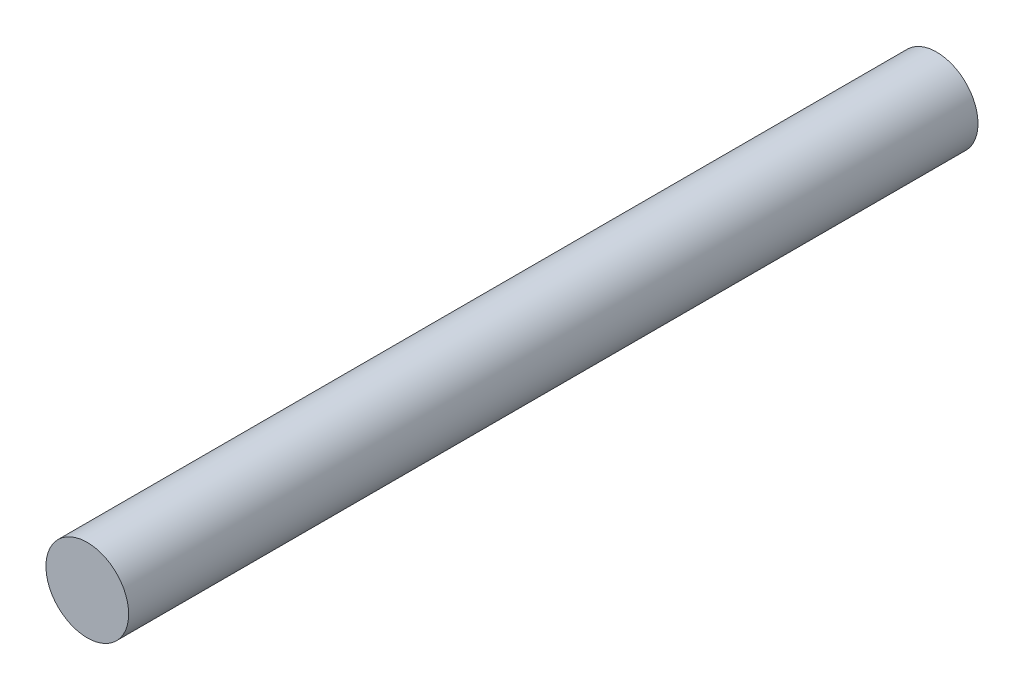
ISO-10303-21;
HEADER;
FILE_DESCRIPTION(('STEP AP214'),'2;1');
FILE_NAME('part.step','',(''),(''),'','','');
FILE_SCHEMA(('AUTOMOTIVE_DESIGN { 1 0 10303 214 1 1 1 1 }'));
ENDSEC;
DATA;
#1=APPLICATION_CONTEXT('core data for automotive mechanical design processes');
#2=APPLICATION_PROTOCOL_DEFINITION('international standard','automotive_design',2000,#1);
#3=PRODUCT_CONTEXT('',#1,'mechanical');
#4=PRODUCT('Part','Part','',(#3));
#5=PRODUCT_RELATED_PRODUCT_CATEGORY('part','',(#4));
#6=PRODUCT_DEFINITION_FORMATION('','',#4);
#7=PRODUCT_DEFINITION_CONTEXT('part definition',#1,'design');
#8=PRODUCT_DEFINITION('design','',#6,#7);
#9=PRODUCT_DEFINITION_SHAPE('','',#8);
#10=(LENGTH_UNIT() NAMED_UNIT(*) SI_UNIT(.MILLI.,.METRE.));
#11=(NAMED_UNIT(*) PLANE_ANGLE_UNIT() SI_UNIT($,.RADIAN.));
#12=(NAMED_UNIT(*) SI_UNIT($,.STERADIAN.) SOLID_ANGLE_UNIT());
#13=UNCERTAINTY_MEASURE_WITH_UNIT(LENGTH_MEASURE(1.E-05),#10,'distance_accuracy_value','');
#14=(GEOMETRIC_REPRESENTATION_CONTEXT(3) GLOBAL_UNCERTAINTY_ASSIGNED_CONTEXT((#13)) GLOBAL_UNIT_ASSIGNED_CONTEXT((#10,
#11,#12)) REPRESENTATION_CONTEXT('',''));
#15=CARTESIAN_POINT('',(0.,0.,0.));
#16=DIRECTION('',(0.,0.,1.));
#17=DIRECTION('',(1.,0.,0.));
#18=AXIS2_PLACEMENT_3D('',#15,#16,#17);
#19=CARTESIAN_POINT('',(0.,0.,115.));
#20=DIRECTION('',(0.,0.,-1.));
#21=DIRECTION('',(-1.,0.,0.));
#22=AXIS2_PLACEMENT_3D('',#19,#20,#21);
#23=CYLINDRICAL_SURFACE('',#22,5.6);
#24=CARTESIAN_POINT('',(0.,0.,0.));
#25=DIRECTION('',(0.,0.,1.));
#26=DIRECTION('',(1.,0.,0.));
#27=AXIS2_PLACEMENT_3D('',#24,#25,#26);
#28=CIRCLE('',#27,5.6);
#29=CARTESIAN_POINT('',(5.6,0.,0.));
#30=VERTEX_POINT('',#29);
#31=EDGE_CURVE('E104',#30,#30,#28,.T.);
#32=ORIENTED_EDGE('',*,*,#31,.T.);
#33=EDGE_LOOP('',(#32));
#34=FACE_BOUND('',#33,.T.);
#35=CARTESIAN_POINT('',(0.,0.,115.));
#36=DIRECTION('',(0.,0.,1.));
#37=DIRECTION('',(1.,0.,0.));
#38=AXIS2_PLACEMENT_3D('',#35,#36,#37);
#39=CIRCLE('',#38,5.6);
#40=CARTESIAN_POINT('',(5.6,0.,115.));
#41=VERTEX_POINT('',#40);
#42=EDGE_CURVE('E107',#41,#41,#39,.T.);
#43=ORIENTED_EDGE('',*,*,#42,.F.);
#44=EDGE_LOOP('',(#43));
#45=FACE_BOUND('',#44,.T.);
#46=CARTESIAN_POINT('',(0.,0.,30.));
#47=DIRECTION('',(0.,0.,1.));
#48=DIRECTION('',(1.,0.,0.));
#49=AXIS2_PLACEMENT_3D('',#46,#47,#48);
#50=CIRCLE('',#49,5.6);
#51=CARTESIAN_POINT('',(-2.75,-4.87826813531196,30.));
#52=VERTEX_POINT('',#51);
#53=CARTESIAN_POINT('',(2.75,-4.87826813531195,30.));
#54=VERTEX_POINT('',#53);
#55=EDGE_CURVE('E11',#52,#54,#50,.T.);
#56=ORIENTED_EDGE('',*,*,#55,.F.);
#57=DIRECTION('',(0.,0.,-1.));
#58=VECTOR('',#57,1.);
#59=CARTESIAN_POINT('',(-2.75,-4.87826813531196,115.));
#60=LINE('',#59,#58);
#61=CARTESIAN_POINT('',(-2.75,-4.87826813531196,85.));
#62=VERTEX_POINT('',#61);
#63=EDGE_CURVE('E42',#52,#62,#60,.F.);
#64=ORIENTED_EDGE('',*,*,#63,.T.);
#65=CARTESIAN_POINT('',(0.,0.,85.));
#66=DIRECTION('',(0.,0.,1.));
#67=DIRECTION('',(1.,0.,0.));
#68=AXIS2_PLACEMENT_3D('',#65,#66,#67);
#69=CIRCLE('',#68,5.6);
#70=CARTESIAN_POINT('',(2.75,-4.87826813531195,85.));
#71=VERTEX_POINT('',#70);
#72=EDGE_CURVE('E110',#62,#71,#69,.T.);
#73=ORIENTED_EDGE('',*,*,#72,.T.);
#74=DIRECTION('',(0.,0.,-1.));
#75=VECTOR('',#74,1.);
#76=CARTESIAN_POINT('',(2.75,-4.87826813531196,115.));
#77=LINE('',#76,#75);
#78=EDGE_CURVE('E115',#71,#54,#77,.T.);
#79=ORIENTED_EDGE('',*,*,#78,.T.);
#80=EDGE_LOOP('',(#56,#64,#73,#79));
#81=FACE_BOUND('',#80,.T.);
#82=ADVANCED_FACE('F35',(#34,#45,#81),#23,.T.);
#83=CARTESIAN_POINT('',(0.,0.,115.));
#84=DIRECTION('',(0.,0.,1.));
#85=DIRECTION('',(1.,0.,0.));
#86=AXIS2_PLACEMENT_3D('',#83,#84,#85);
#87=PLANE('',#86);
#88=ORIENTED_EDGE('',*,*,#42,.T.);
#89=EDGE_LOOP('',(#88));
#90=FACE_BOUND('',#89,.T.);
#91=ADVANCED_FACE('F131',(#90),#87,.T.);
#92=CARTESIAN_POINT('',(0.,0.,0.));
#93=DIRECTION('',(0.,0.,1.));
#94=DIRECTION('',(1.,0.,0.));
#95=AXIS2_PLACEMENT_3D('',#92,#93,#94);
#96=PLANE('',#95);
#97=CARTESIAN_POINT('',(0.,0.,0.));
#98=DIRECTION('',(0.,0.,1.));
#99=DIRECTION('',(1.,0.,0.));
#100=AXIS2_PLACEMENT_3D('',#97,#98,#99);
#101=CIRCLE('',#100,4.6);
#102=CARTESIAN_POINT('',(4.6,0.,0.));
#103=VERTEX_POINT('',#102);
#104=EDGE_CURVE('E99',#103,#103,#101,.T.);
#105=ORIENTED_EDGE('',*,*,#104,.T.);
#106=EDGE_LOOP('',(#105));
#107=FACE_BOUND('',#106,.T.);
#108=ORIENTED_EDGE('',*,*,#31,.F.);
#109=EDGE_LOOP('',(#108));
#110=FACE_BOUND('',#109,.T.);
#111=ADVANCED_FACE('F138',(#107,#110),#96,.F.);
#112=CARTESIAN_POINT('',(0.,0.,113.));
#113=DIRECTION('',(0.,0.,-1.));
#114=DIRECTION('',(-1.,0.,0.));
#115=AXIS2_PLACEMENT_3D('',#112,#113,#114);
#116=CYLINDRICAL_SURFACE('',#115,4.6);
#117=CARTESIAN_POINT('',(0.,0.,113.));
#118=DIRECTION('',(0.,0.,1.));
#119=DIRECTION('',(1.,0.,0.));
#120=AXIS2_PLACEMENT_3D('',#117,#118,#119);
#121=CIRCLE('',#120,4.6);
#122=CARTESIAN_POINT('',(4.6,0.,113.));
#123=VERTEX_POINT('',#122);
#124=EDGE_CURVE('E101',#123,#123,#121,.T.);
#125=ORIENTED_EDGE('',*,*,#124,.T.);
#126=EDGE_LOOP('',(#125));
#127=FACE_BOUND('',#126,.T.);
#128=ORIENTED_EDGE('',*,*,#104,.F.);
#129=EDGE_LOOP('',(#128));
#130=FACE_BOUND('',#129,.T.);
#131=ADVANCED_FACE('F146',(#127,#130),#116,.F.);
#132=CARTESIAN_POINT('',(0.,0.,113.));
#133=DIRECTION('',(0.,0.,1.));
#134=DIRECTION('',(1.,0.,0.));
#135=AXIS2_PLACEMENT_3D('',#132,#133,#134);
#136=PLANE('',#135);
#137=ORIENTED_EDGE('',*,*,#124,.F.);
#138=EDGE_LOOP('',(#137));
#139=FACE_BOUND('',#138,.T.);
#140=ADVANCED_FACE('F151',(#139),#136,.F.);
#141=CARTESIAN_POINT('',(-2.75,-6.34455889805676,30.));
#142=DIRECTION('',(-1.,0.,0.));
#143=DIRECTION('',(0.,0.,1.));
#144=AXIS2_PLACEMENT_3D('',#141,#142,#143);
#145=PLANE('',#144);
#146=DIRECTION('',(0.,-1.,0.));
#147=VECTOR('',#146,1.);
#148=CARTESIAN_POINT('',(-2.75,-6.34455889805676,30.));
#149=LINE('',#148,#147);
#150=CARTESIAN_POINT('',(-2.75,-4.85544110194324,30.));
#151=VERTEX_POINT('',#150);
#152=EDGE_CURVE('E79',#151,#52,#149,.T.);
#153=ORIENTED_EDGE('',*,*,#152,.F.);
#154=DIRECTION('',(0.,0.,1.));
#155=VECTOR('',#154,1.);
#156=CARTESIAN_POINT('',(-2.75,-4.85544110194324,30.));
#157=LINE('',#156,#155);
#158=CARTESIAN_POINT('',(-2.75,-4.85544110194324,85.));
#159=VERTEX_POINT('',#158);
#160=EDGE_CURVE('E86',#151,#159,#157,.T.);
#161=ORIENTED_EDGE('',*,*,#160,.T.);
#162=DIRECTION('',(0.,-1.,0.));
#163=VECTOR('',#162,1.);
#164=CARTESIAN_POINT('',(-2.75,-6.34455889805676,85.));
#165=LINE('',#164,#163);
#166=EDGE_CURVE('E93',#159,#62,#165,.T.);
#167=ORIENTED_EDGE('',*,*,#166,.T.);
#168=ORIENTED_EDGE('',*,*,#63,.F.);
#169=EDGE_LOOP('',(#153,#161,#167,#168));
#170=FACE_BOUND('',#169,.T.);
#171=ADVANCED_FACE('F119',(#170),#145,.F.);
#172=CARTESIAN_POINT('',(2.75,-6.34455889805676,30.));
#173=DIRECTION('',(1.,0.,0.));
#174=DIRECTION('',(0.,0.,-1.));
#175=AXIS2_PLACEMENT_3D('',#172,#173,#174);
#176=PLANE('',#175);
#177=DIRECTION('',(0.,1.,0.));
#178=VECTOR('',#177,1.);
#179=CARTESIAN_POINT('',(2.75,-6.34455889805676,85.));
#180=LINE('',#179,#178);
#181=CARTESIAN_POINT('',(2.75,-4.85544110194324,85.));
#182=VERTEX_POINT('',#181);
#183=EDGE_CURVE('E49',#71,#182,#180,.T.);
#184=ORIENTED_EDGE('',*,*,#183,.T.);
#185=DIRECTION('',(0.,0.,1.));
#186=VECTOR('',#185,1.);
#187=CARTESIAN_POINT('',(2.75,-4.85544110194324,30.));
#188=LINE('',#187,#186);
#189=CARTESIAN_POINT('',(2.75,-4.85544110194324,30.));
#190=VERTEX_POINT('',#189);
#191=EDGE_CURVE('E82',#190,#182,#188,.T.);
#192=ORIENTED_EDGE('',*,*,#191,.F.);
#193=DIRECTION('',(0.,1.,0.));
#194=VECTOR('',#193,1.);
#195=CARTESIAN_POINT('',(2.75,-6.34455889805676,30.));
#196=LINE('',#195,#194);
#197=EDGE_CURVE('E72',#54,#190,#196,.T.);
#198=ORIENTED_EDGE('',*,*,#197,.F.);
#199=ORIENTED_EDGE('',*,*,#78,.F.);
#200=EDGE_LOOP('',(#184,#192,#198,#199));
#201=FACE_BOUND('',#200,.T.);
#202=ADVANCED_FACE('F83',(#201),#176,.F.);
#203=CARTESIAN_POINT('',(0.,0.,30.));
#204=DIRECTION('',(0.,0.,1.));
#205=DIRECTION('',(1.,0.,0.));
#206=AXIS2_PLACEMENT_3D('',#203,#204,#205);
#207=PLANE('',#206);
#208=ORIENTED_EDGE('',*,*,#55,.T.);
#209=ORIENTED_EDGE('',*,*,#197,.T.);
#210=DIRECTION('',(-1.,0.,0.));
#211=VECTOR('',#210,1.);
#212=CARTESIAN_POINT('',(2.75,-4.85544110194324,30.));
#213=LINE('',#212,#211);
#214=EDGE_CURVE('E76',#190,#151,#213,.T.);
#215=ORIENTED_EDGE('',*,*,#214,.T.);
#216=ORIENTED_EDGE('',*,*,#152,.T.);
#217=EDGE_LOOP('',(#208,#209,#215,#216));
#218=FACE_BOUND('',#217,.T.);
#219=ADVANCED_FACE('F74',(#218),#207,.T.);
#220=CARTESIAN_POINT('',(0.,0.,85.));
#221=DIRECTION('',(0.,0.,1.));
#222=DIRECTION('',(1.,0.,0.));
#223=AXIS2_PLACEMENT_3D('',#220,#221,#222);
#224=PLANE('',#223);
#225=ORIENTED_EDGE('',*,*,#166,.F.);
#226=DIRECTION('',(-1.,0.,0.));
#227=VECTOR('',#226,1.);
#228=CARTESIAN_POINT('',(2.75,-4.85544110194324,85.));
#229=LINE('',#228,#227);
#230=EDGE_CURVE('E97',#182,#159,#229,.T.);
#231=ORIENTED_EDGE('',*,*,#230,.F.);
#232=ORIENTED_EDGE('',*,*,#183,.F.);
#233=ORIENTED_EDGE('',*,*,#72,.F.);
#234=EDGE_LOOP('',(#225,#231,#232,#233));
#235=FACE_BOUND('',#234,.T.);
#236=ADVANCED_FACE('F121',(#235),#224,.F.);
#237=CARTESIAN_POINT('',(2.75,-4.85544110194324,30.));
#238=DIRECTION('',(0.,1.,0.));
#239=DIRECTION('',(-1.,0.,0.));
#240=AXIS2_PLACEMENT_3D('',#237,#238,#239);
#241=PLANE('',#240);
#242=ORIENTED_EDGE('',*,*,#230,.T.);
#243=ORIENTED_EDGE('',*,*,#160,.F.);
#244=ORIENTED_EDGE('',*,*,#214,.F.);
#245=ORIENTED_EDGE('',*,*,#191,.T.);
#246=EDGE_LOOP('',(#242,#243,#244,#245));
#247=FACE_BOUND('',#246,.T.);
#248=ADVANCED_FACE('F88',(#247),#241,.F.);
#249=CLOSED_SHELL('',(#82,#91,#111,#131,#140,#171,#202,#219,#236,#248));
#250=MANIFOLD_SOLID_BREP('B2',#249);
#251=ADVANCED_BREP_SHAPE_REPRESENTATION('',(#18,#250),#14);
#252=SHAPE_DEFINITION_REPRESENTATION(#9,#251);
ENDSEC;
END-ISO-10303-21;
